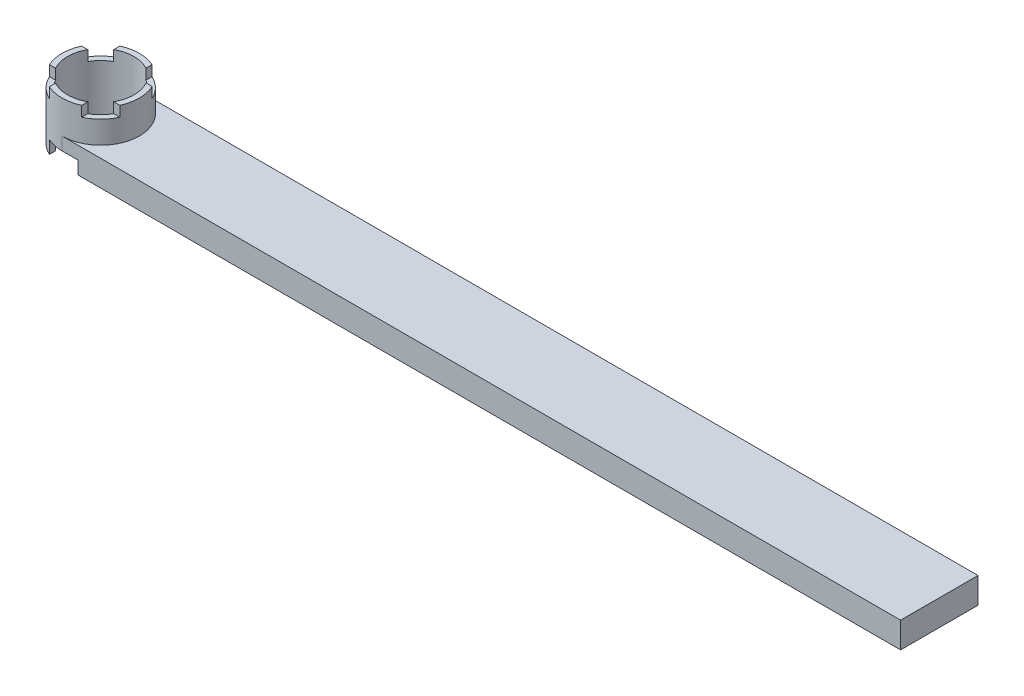
ISO-10303-21;
HEADER;
FILE_DESCRIPTION(('STEP AP214'),'2;1');
FILE_NAME('part.step','',(''),(''),'','','');
FILE_SCHEMA(('AUTOMOTIVE_DESIGN { 1 0 10303 214 1 1 1 1 }'));
ENDSEC;
DATA;
#1=APPLICATION_CONTEXT('core data for automotive mechanical design processes');
#2=APPLICATION_PROTOCOL_DEFINITION('international standard','automotive_design',2000,#1);
#3=PRODUCT_CONTEXT('',#1,'mechanical');
#4=PRODUCT('Part','Part','',(#3));
#5=PRODUCT_RELATED_PRODUCT_CATEGORY('part','',(#4));
#6=PRODUCT_DEFINITION_FORMATION('','',#4);
#7=PRODUCT_DEFINITION_CONTEXT('part definition',#1,'design');
#8=PRODUCT_DEFINITION('design','',#6,#7);
#9=PRODUCT_DEFINITION_SHAPE('','',#8);
#10=(LENGTH_UNIT() NAMED_UNIT(*) SI_UNIT(.MILLI.,.METRE.));
#11=(NAMED_UNIT(*) PLANE_ANGLE_UNIT() SI_UNIT($,.RADIAN.));
#12=(NAMED_UNIT(*) SI_UNIT($,.STERADIAN.) SOLID_ANGLE_UNIT());
#13=UNCERTAINTY_MEASURE_WITH_UNIT(LENGTH_MEASURE(1.E-05),#10,'distance_accuracy_value','');
#14=(GEOMETRIC_REPRESENTATION_CONTEXT(3) GLOBAL_UNCERTAINTY_ASSIGNED_CONTEXT((#13)) GLOBAL_UNIT_ASSIGNED_CONTEXT((#10,
#11,#12)) REPRESENTATION_CONTEXT('',''));
#15=CARTESIAN_POINT('',(0.,0.,0.));
#16=DIRECTION('',(0.,0.,1.));
#17=DIRECTION('',(1.,0.,0.));
#18=AXIS2_PLACEMENT_3D('',#15,#16,#17);
#19=CARTESIAN_POINT('',(0.,7.5,0.));
#20=DIRECTION('',(0.,1.,0.));
#21=DIRECTION('',(0.,0.,1.));
#22=AXIS2_PLACEMENT_3D('',#19,#20,#21);
#23=PLANE('',#22);
#24=CARTESIAN_POINT('',(0.,7.5,0.));
#25=DIRECTION('',(0.,1.,0.));
#26=DIRECTION('',(0.,0.,1.));
#27=AXIS2_PLACEMENT_3D('',#24,#25,#26);
#28=CIRCLE('',#27,6.);
#29=CARTESIAN_POINT('',(-2.5,7.5,-5.45435605731786));
#30=VERTEX_POINT('',#29);
#31=CARTESIAN_POINT('',(-5.45435605731786,7.5,-2.5));
#32=VERTEX_POINT('',#31);
#33=EDGE_CURVE('E719',#30,#32,#28,.T.);
#34=ORIENTED_EDGE('',*,*,#33,.T.);
#35=DIRECTION('',(1.,0.,0.));
#36=VECTOR('',#35,1.);
#37=CARTESIAN_POINT('',(0.,7.5,-2.5));
#38=LINE('',#37,#36);
#39=CARTESIAN_POINT('',(-4.50249930594109,7.5,-2.5));
#40=VERTEX_POINT('',#39);
#41=EDGE_CURVE('E298',#32,#40,#38,.T.);
#42=ORIENTED_EDGE('',*,*,#41,.T.);
#43=CARTESIAN_POINT('',(0.,7.5,0.));
#44=DIRECTION('',(0.,1.,0.));
#45=DIRECTION('',(0.,0.,1.));
#46=AXIS2_PLACEMENT_3D('',#43,#44,#45);
#47=CIRCLE('',#46,5.15);
#48=CARTESIAN_POINT('',(-2.5,7.5,-4.50249930594109));
#49=VERTEX_POINT('',#48);
#50=EDGE_CURVE('E692',#49,#40,#47,.T.);
#51=ORIENTED_EDGE('',*,*,#50,.F.);
#52=DIRECTION('',(0.,0.,-1.));
#53=VECTOR('',#52,1.);
#54=CARTESIAN_POINT('',(-2.5,7.5,0.));
#55=LINE('',#54,#53);
#56=EDGE_CURVE('E345',#49,#30,#55,.T.);
#57=ORIENTED_EDGE('',*,*,#56,.T.);
#58=EDGE_LOOP('',(#34,#42,#51,#57));
#59=FACE_BOUND('',#58,.T.);
#60=ADVANCED_FACE('F53',(#59),#23,.T.);
#61=CARTESIAN_POINT('',(-4.50249930594109,7.5,2.5));
#62=VERTEX_POINT('',#61);
#63=CARTESIAN_POINT('',(-2.5,7.5,4.50249930594109));
#64=VERTEX_POINT('',#63);
#65=EDGE_CURVE('E554',#62,#64,#47,.T.);
#66=ORIENTED_EDGE('',*,*,#65,.F.);
#67=DIRECTION('',(-1.,0.,0.));
#68=VECTOR('',#67,1.);
#69=CARTESIAN_POINT('',(0.,7.5,2.5));
#70=LINE('',#69,#68);
#71=CARTESIAN_POINT('',(-5.45435605731786,7.5,2.5));
#72=VERTEX_POINT('',#71);
#73=EDGE_CURVE('E320',#62,#72,#70,.T.);
#74=ORIENTED_EDGE('',*,*,#73,.T.);
#75=CARTESIAN_POINT('',(-2.5,7.5,5.45435605731786));
#76=VERTEX_POINT('',#75);
#77=EDGE_CURVE('E561',#72,#76,#28,.T.);
#78=ORIENTED_EDGE('',*,*,#77,.T.);
#79=DIRECTION('',(0.,0.,-1.));
#80=VECTOR('',#79,1.);
#81=CARTESIAN_POINT('',(-2.5,7.5,0.));
#82=LINE('',#81,#80);
#83=EDGE_CURVE('E421',#76,#64,#82,.T.);
#84=ORIENTED_EDGE('',*,*,#83,.T.);
#85=EDGE_LOOP('',(#66,#74,#78,#84));
#86=FACE_BOUND('',#85,.T.);
#87=ADVANCED_FACE('F725',(#86),#23,.T.);
#88=CARTESIAN_POINT('',(5.44050549122046,7.5,-2.53));
#89=VERTEX_POINT('',#88);
#90=CARTESIAN_POINT('',(2.5,7.5,-5.45435605731786));
#91=VERTEX_POINT('',#90);
#92=EDGE_CURVE('E560',#89,#91,#28,.T.);
#93=ORIENTED_EDGE('',*,*,#92,.T.);
#94=DIRECTION('',(0.,0.,1.));
#95=VECTOR('',#94,1.);
#96=CARTESIAN_POINT('',(2.5,7.5,0.));
#97=LINE('',#96,#95);
#98=CARTESIAN_POINT('',(2.5,7.5,-4.50249930594109));
#99=VERTEX_POINT('',#98);
#100=EDGE_CURVE('E355',#91,#99,#97,.T.);
#101=ORIENTED_EDGE('',*,*,#100,.T.);
#102=CARTESIAN_POINT('',(4.48571064604038,7.5,-2.53));
#103=VERTEX_POINT('',#102);
#104=EDGE_CURVE('E553',#103,#99,#47,.T.);
#105=ORIENTED_EDGE('',*,*,#104,.F.);
#106=DIRECTION('',(1.,0.,0.));
#107=VECTOR('',#106,1.);
#108=CARTESIAN_POINT('',(0.,7.5,-2.53));
#109=LINE('',#108,#107);
#110=EDGE_CURVE('E376',#103,#89,#109,.T.);
#111=ORIENTED_EDGE('',*,*,#110,.T.);
#112=EDGE_LOOP('',(#93,#101,#105,#111));
#113=FACE_BOUND('',#112,.T.);
#114=ADVANCED_FACE('F707',(#113),#23,.T.);
#115=CARTESIAN_POINT('',(2.5,7.5,5.45435605731786));
#116=VERTEX_POINT('',#115);
#117=CARTESIAN_POINT('',(5.45435605731786,7.5,2.5));
#118=VERTEX_POINT('',#117);
#119=EDGE_CURVE('E555',#116,#118,#28,.T.);
#120=ORIENTED_EDGE('',*,*,#119,.T.);
#121=DIRECTION('',(-1.,0.,0.));
#122=VECTOR('',#121,1.);
#123=CARTESIAN_POINT('',(0.,7.5,2.5));
#124=LINE('',#123,#122);
#125=CARTESIAN_POINT('',(4.50249930594109,7.5,2.5));
#126=VERTEX_POINT('',#125);
#127=EDGE_CURVE('E387',#118,#126,#124,.T.);
#128=ORIENTED_EDGE('',*,*,#127,.T.);
#129=CARTESIAN_POINT('',(2.5,7.5,4.50249930594109));
#130=VERTEX_POINT('',#129);
#131=EDGE_CURVE('E548',#130,#126,#47,.T.);
#132=ORIENTED_EDGE('',*,*,#131,.F.);
#133=DIRECTION('',(0.,0.,1.));
#134=VECTOR('',#133,1.);
#135=CARTESIAN_POINT('',(2.5,7.5,0.));
#136=LINE('',#135,#134);
#137=EDGE_CURVE('E410',#130,#116,#136,.T.);
#138=ORIENTED_EDGE('',*,*,#137,.T.);
#139=EDGE_LOOP('',(#120,#128,#132,#138));
#140=FACE_BOUND('',#139,.T.);
#141=ADVANCED_FACE('F741',(#140),#23,.T.);
#142=CARTESIAN_POINT('',(0.,4.,-6.));
#143=DIRECTION('',(0.,0.,-1.));
#144=DIRECTION('',(-1.,0.,0.));
#145=AXIS2_PLACEMENT_3D('',#142,#143,#144);
#146=PLANE('',#145);
#147=DIRECTION('',(1.,0.,0.));
#148=VECTOR('',#147,1.);
#149=CARTESIAN_POINT('',(0.,0.,-6.));
#150=LINE('',#149,#148);
#151=CARTESIAN_POINT('',(2.5,0.,-6.));
#152=VERTEX_POINT('',#151);
#153=CARTESIAN_POINT('',(130.,0.,-6.));
#154=VERTEX_POINT('',#153);
#155=EDGE_CURVE('E559',#152,#154,#150,.T.);
#156=ORIENTED_EDGE('',*,*,#155,.F.);
#157=DIRECTION('',(0.,1.,0.));
#158=VECTOR('',#157,1.);
#159=CARTESIAN_POINT('',(2.5,4.,-6.));
#160=LINE('',#159,#158);
#161=CARTESIAN_POINT('',(2.5,2.,-6.));
#162=VERTEX_POINT('',#161);
#163=EDGE_CURVE('E529',#152,#162,#160,.T.);
#164=ORIENTED_EDGE('',*,*,#163,.T.);
#165=DIRECTION('',(-1.,0.,0.));
#166=VECTOR('',#165,1.);
#167=CARTESIAN_POINT('',(0.,2.,-6.));
#168=LINE('',#167,#166);
#169=CARTESIAN_POINT('',(0.,2.,-6.));
#170=VERTEX_POINT('',#169);
#171=EDGE_CURVE('E544',#162,#170,#168,.T.);
#172=ORIENTED_EDGE('',*,*,#171,.T.);
#173=DIRECTION('',(0.,-1.,0.));
#174=VECTOR('',#173,1.);
#175=CARTESIAN_POINT('',(0.,4.,-6.));
#176=LINE('',#175,#174);
#177=CARTESIAN_POINT('',(0.,4.,-6.));
#178=VERTEX_POINT('',#177);
#179=EDGE_CURVE('E608',#178,#170,#176,.T.);
#180=ORIENTED_EDGE('',*,*,#179,.F.);
#181=DIRECTION('',(1.,0.,0.));
#182=VECTOR('',#181,1.);
#183=CARTESIAN_POINT('',(0.,4.,-6.));
#184=LINE('',#183,#182);
#185=CARTESIAN_POINT('',(130.,4.,-6.));
#186=VERTEX_POINT('',#185);
#187=EDGE_CURVE('E565',#178,#186,#184,.T.);
#188=ORIENTED_EDGE('',*,*,#187,.T.);
#189=DIRECTION('',(0.,-1.,0.));
#190=VECTOR('',#189,1.);
#191=CARTESIAN_POINT('',(130.,4.,-6.));
#192=LINE('',#191,#190);
#193=EDGE_CURVE('E577',#186,#154,#192,.T.);
#194=ORIENTED_EDGE('',*,*,#193,.T.);
#195=EDGE_LOOP('',(#156,#164,#172,#180,#188,#194));
#196=FACE_BOUND('',#195,.T.);
#197=ADVANCED_FACE('F55',(#196),#146,.T.);
#198=CARTESIAN_POINT('',(0.,4.,0.));
#199=DIRECTION('',(0.,-1.,0.));
#200=DIRECTION('',(0.,0.,-1.));
#201=AXIS2_PLACEMENT_3D('',#198,#199,#200);
#202=CYLINDRICAL_SURFACE('',#201,6.);
#203=ORIENTED_EDGE('',*,*,#119,.F.);
#204=DIRECTION('',(0.,-1.,0.));
#205=VECTOR('',#204,1.);
#206=CARTESIAN_POINT('',(2.5,9.1,5.45435605731786));
#207=LINE('',#206,#205);
#208=CARTESIAN_POINT('',(2.5,9.1,5.45435605731786));
#209=VERTEX_POINT('',#208);
#210=EDGE_CURVE('E433',#209,#116,#207,.T.);
#211=ORIENTED_EDGE('',*,*,#210,.F.);
#212=CARTESIAN_POINT('',(0.,9.1,0.));
#213=DIRECTION('',(0.,1.,0.));
#214=DIRECTION('',(0.,0.,1.));
#215=AXIS2_PLACEMENT_3D('',#212,#213,#214);
#216=CIRCLE('',#215,6.);
#217=CARTESIAN_POINT('',(-2.5,9.1,5.45435605731786));
#218=VERTEX_POINT('',#217);
#219=EDGE_CURVE('E409',#218,#209,#216,.T.);
#220=ORIENTED_EDGE('',*,*,#219,.F.);
#221=DIRECTION('',(0.,-1.,0.));
#222=VECTOR('',#221,1.);
#223=CARTESIAN_POINT('',(-2.5,9.1,5.45435605731786));
#224=LINE('',#223,#222);
#225=EDGE_CURVE('E391',#218,#76,#224,.T.);
#226=ORIENTED_EDGE('',*,*,#225,.T.);
#227=ORIENTED_EDGE('',*,*,#77,.F.);
#228=DIRECTION('',(0.,-1.,0.));
#229=VECTOR('',#228,1.);
#230=CARTESIAN_POINT('',(-5.45435605731786,9.1,2.5));
#231=LINE('',#230,#229);
#232=CARTESIAN_POINT('',(-5.45435605731786,9.1,2.5));
#233=VERTEX_POINT('',#232);
#234=EDGE_CURVE('E70',#233,#72,#231,.T.);
#235=ORIENTED_EDGE('',*,*,#234,.F.);
#236=CARTESIAN_POINT('',(0.,9.1,0.));
#237=DIRECTION('',(0.,1.,0.));
#238=DIRECTION('',(0.,0.,1.));
#239=AXIS2_PLACEMENT_3D('',#236,#237,#238);
#240=CIRCLE('',#239,6.);
#241=CARTESIAN_POINT('',(-5.45435605731786,9.1,-2.5));
#242=VERTEX_POINT('',#241);
#243=EDGE_CURVE('E305',#242,#233,#240,.T.);
#244=ORIENTED_EDGE('',*,*,#243,.F.);
#245=DIRECTION('',(0.,-1.,0.));
#246=VECTOR('',#245,1.);
#247=CARTESIAN_POINT('',(-5.45435605731786,9.1,-2.5));
#248=LINE('',#247,#246);
#249=EDGE_CURVE('E292',#242,#32,#248,.T.);
#250=ORIENTED_EDGE('',*,*,#249,.T.);
#251=ORIENTED_EDGE('',*,*,#33,.F.);
#252=DIRECTION('',(0.,-1.,0.));
#253=VECTOR('',#252,1.);
#254=CARTESIAN_POINT('',(-2.5,9.1,-5.45435605731786));
#255=LINE('',#254,#253);
#256=CARTESIAN_POINT('',(-2.5,9.1,-5.45435605731786));
#257=VERTEX_POINT('',#256);
#258=EDGE_CURVE('E78',#257,#30,#255,.T.);
#259=ORIENTED_EDGE('',*,*,#258,.F.);
#260=CARTESIAN_POINT('',(0.,9.1,0.));
#261=DIRECTION('',(0.,1.,0.));
#262=DIRECTION('',(0.,0.,1.));
#263=AXIS2_PLACEMENT_3D('',#260,#261,#262);
#264=CIRCLE('',#263,6.);
#265=CARTESIAN_POINT('',(2.5,9.1,-5.45435605731786));
#266=VERTEX_POINT('',#265);
#267=EDGE_CURVE('E344',#266,#257,#264,.T.);
#268=ORIENTED_EDGE('',*,*,#267,.F.);
#269=DIRECTION('',(0.,-1.,0.));
#270=VECTOR('',#269,1.);
#271=CARTESIAN_POINT('',(2.5,9.1,-5.45435605731786));
#272=LINE('',#271,#270);
#273=EDGE_CURVE('E331',#266,#91,#272,.T.);
#274=ORIENTED_EDGE('',*,*,#273,.T.);
#275=ORIENTED_EDGE('',*,*,#92,.F.);
#276=DIRECTION('',(0.,-1.,0.));
#277=VECTOR('',#276,1.);
#278=CARTESIAN_POINT('',(5.44050549122046,9.1,-2.53));
#279=LINE('',#278,#277);
#280=CARTESIAN_POINT('',(5.44050549122046,9.1,-2.53));
#281=VERTEX_POINT('',#280);
#282=EDGE_CURVE('E400',#281,#89,#279,.T.);
#283=ORIENTED_EDGE('',*,*,#282,.F.);
#284=CARTESIAN_POINT('',(0.,9.1,0.));
#285=DIRECTION('',(0.,1.,0.));
#286=DIRECTION('',(0.,0.,1.));
#287=AXIS2_PLACEMENT_3D('',#284,#285,#286);
#288=CIRCLE('',#287,6.);
#289=CARTESIAN_POINT('',(5.45435605731786,9.1,2.5));
#290=VERTEX_POINT('',#289);
#291=EDGE_CURVE('E375',#290,#281,#288,.T.);
#292=ORIENTED_EDGE('',*,*,#291,.F.);
#293=DIRECTION('',(0.,-1.,0.));
#294=VECTOR('',#293,1.);
#295=CARTESIAN_POINT('',(5.45435605731786,9.1,2.5));
#296=LINE('',#295,#294);
#297=EDGE_CURVE('E359',#290,#118,#296,.T.);
#298=ORIENTED_EDGE('',*,*,#297,.T.);
#299=EDGE_LOOP('',(#203,#211,#220,#226,#227,#235,#244,#250,#251,#259,#268,#274,#275,#283,#292,#298));
#300=FACE_BOUND('',#299,.T.);
#301=DIRECTION('',(0.,-1.,0.));
#302=VECTOR('',#301,1.);
#303=CARTESIAN_POINT('',(-2.5,4.,5.45435605731786));
#304=LINE('',#303,#302);
#305=CARTESIAN_POINT('',(-2.5,2.,5.45435605731786));
#306=VERTEX_POINT('',#305);
#307=CARTESIAN_POINT('',(-2.5,0.,5.45435605731786));
#308=VERTEX_POINT('',#307);
#309=EDGE_CURVE('E501',#306,#308,#304,.T.);
#310=ORIENTED_EDGE('',*,*,#309,.F.);
#311=CARTESIAN_POINT('',(0.,2.,0.));
#312=DIRECTION('',(0.,-1.,0.));
#313=DIRECTION('',(0.,0.,-1.));
#314=AXIS2_PLACEMENT_3D('',#311,#312,#313);
#315=CIRCLE('',#314,6.);
#316=CARTESIAN_POINT('',(0.,2.,6.));
#317=VERTEX_POINT('',#316);
#318=EDGE_CURVE('E539',#317,#306,#315,.T.);
#319=ORIENTED_EDGE('',*,*,#318,.F.);
#320=DIRECTION('',(0.,-1.,0.));
#321=VECTOR('',#320,1.);
#322=CARTESIAN_POINT('',(0.,4.,6.));
#323=LINE('',#322,#321);
#324=CARTESIAN_POINT('',(0.,4.,6.));
#325=VERTEX_POINT('',#324);
#326=EDGE_CURVE('E604',#325,#317,#323,.T.);
#327=ORIENTED_EDGE('',*,*,#326,.F.);
#328=CARTESIAN_POINT('',(0.,4.,0.));
#329=DIRECTION('',(0.,1.,0.));
#330=DIRECTION('',(0.,0.,1.));
#331=AXIS2_PLACEMENT_3D('',#328,#329,#330);
#332=CIRCLE('',#331,6.);
#333=EDGE_CURVE('E552',#325,#178,#332,.T.);
#334=ORIENTED_EDGE('',*,*,#333,.T.);
#335=ORIENTED_EDGE('',*,*,#179,.T.);
#336=CARTESIAN_POINT('',(-2.5,2.,-5.45435605731786));
#337=VERTEX_POINT('',#336);
#338=EDGE_CURVE('E542',#337,#170,#315,.T.);
#339=ORIENTED_EDGE('',*,*,#338,.F.);
#340=DIRECTION('',(0.,-1.,0.));
#341=VECTOR('',#340,1.);
#342=CARTESIAN_POINT('',(-2.5,4.,-5.45435605731786));
#343=LINE('',#342,#341);
#344=CARTESIAN_POINT('',(-2.5,0.,-5.45435605731786));
#345=VERTEX_POINT('',#344);
#346=EDGE_CURVE('E521',#337,#345,#343,.T.);
#347=ORIENTED_EDGE('',*,*,#346,.T.);
#348=CARTESIAN_POINT('',(0.,0.,0.));
#349=DIRECTION('',(0.,1.,0.));
#350=DIRECTION('',(0.,0.,1.));
#351=AXIS2_PLACEMENT_3D('',#348,#349,#350);
#352=CIRCLE('',#351,6.);
#353=CARTESIAN_POINT('',(-5.45435605731786,0.,-2.5));
#354=VERTEX_POINT('',#353);
#355=EDGE_CURVE('E584',#345,#354,#352,.T.);
#356=ORIENTED_EDGE('',*,*,#355,.T.);
#357=DIRECTION('',(0.,-1.,0.));
#358=VECTOR('',#357,1.);
#359=CARTESIAN_POINT('',(-5.45435605731786,4.,-2.5));
#360=LINE('',#359,#358);
#361=CARTESIAN_POINT('',(-5.45435605731786,2.,-2.5));
#362=VERTEX_POINT('',#361);
#363=EDGE_CURVE('E514',#354,#362,#360,.F.);
#364=ORIENTED_EDGE('',*,*,#363,.T.);
#365=CARTESIAN_POINT('',(-5.45435605731786,2.,2.5));
#366=VERTEX_POINT('',#365);
#367=EDGE_CURVE('E543',#366,#362,#315,.T.);
#368=ORIENTED_EDGE('',*,*,#367,.F.);
#369=DIRECTION('',(0.,-1.,0.));
#370=VECTOR('',#369,1.);
#371=CARTESIAN_POINT('',(-5.45435605731786,4.,2.5));
#372=LINE('',#371,#370);
#373=CARTESIAN_POINT('',(-5.45435605731786,0.,2.5));
#374=VERTEX_POINT('',#373);
#375=EDGE_CURVE('E508',#374,#366,#372,.F.);
#376=ORIENTED_EDGE('',*,*,#375,.F.);
#377=EDGE_CURVE('E580',#374,#308,#352,.T.);
#378=ORIENTED_EDGE('',*,*,#377,.T.);
#379=EDGE_LOOP('',(#310,#319,#327,#334,#335,#339,#347,#356,#364,#368,#376,#378));
#380=FACE_BOUND('',#379,.T.);
#381=ADVANCED_FACE('F307',(#300,#380),#202,.T.);
#382=CARTESIAN_POINT('',(0.,4.,0.));
#383=DIRECTION('',(0.,-1.,0.));
#384=DIRECTION('',(0.,0.,-1.));
#385=AXIS2_PLACEMENT_3D('',#382,#383,#384);
#386=CYLINDRICAL_SURFACE('',#385,5.15);
#387=DIRECTION('',(0.,-1.,0.));
#388=VECTOR('',#387,1.);
#389=CARTESIAN_POINT('',(4.50249930594109,4.,-2.5));
#390=LINE('',#389,#388);
#391=CARTESIAN_POINT('',(4.50249930594109,2.,-2.5));
#392=VERTEX_POINT('',#391);
#393=CARTESIAN_POINT('',(4.50249930594109,0.,-2.5));
#394=VERTEX_POINT('',#393);
#395=EDGE_CURVE('E533',#392,#394,#390,.T.);
#396=ORIENTED_EDGE('',*,*,#395,.F.);
#397=CARTESIAN_POINT('',(0.,2.,0.));
#398=DIRECTION('',(0.,-1.,0.));
#399=DIRECTION('',(0.,0.,-1.));
#400=AXIS2_PLACEMENT_3D('',#397,#398,#399);
#401=CIRCLE('',#400,5.15);
#402=CARTESIAN_POINT('',(4.50249930594109,2.,2.5));
#403=VERTEX_POINT('',#402);
#404=EDGE_CURVE('E12',#392,#403,#401,.T.);
#405=ORIENTED_EDGE('',*,*,#404,.T.);
#406=DIRECTION('',(0.,-1.,0.));
#407=VECTOR('',#406,1.);
#408=CARTESIAN_POINT('',(4.50249930594109,4.,2.5));
#409=LINE('',#408,#407);
#410=CARTESIAN_POINT('',(4.50249930594109,0.,2.5));
#411=VERTEX_POINT('',#410);
#412=EDGE_CURVE('E487',#411,#403,#409,.F.);
#413=ORIENTED_EDGE('',*,*,#412,.F.);
#414=CARTESIAN_POINT('',(0.,0.,0.));
#415=DIRECTION('',(0.,1.,0.));
#416=DIRECTION('',(0.,0.,1.));
#417=AXIS2_PLACEMENT_3D('',#414,#415,#416);
#418=CIRCLE('',#417,5.15);
#419=CARTESIAN_POINT('',(2.5,0.,4.50249930594109));
#420=VERTEX_POINT('',#419);
#421=EDGE_CURVE('E570',#420,#411,#418,.T.);
#422=ORIENTED_EDGE('',*,*,#421,.F.);
#423=DIRECTION('',(0.,-1.,0.));
#424=VECTOR('',#423,1.);
#425=CARTESIAN_POINT('',(2.5,4.,4.50249930594109));
#426=LINE('',#425,#424);
#427=CARTESIAN_POINT('',(2.5,2.,4.50249930594109));
#428=VERTEX_POINT('',#427);
#429=EDGE_CURVE('E490',#428,#420,#426,.T.);
#430=ORIENTED_EDGE('',*,*,#429,.F.);
#431=CARTESIAN_POINT('',(-2.5,2.,4.50249930594109));
#432=VERTEX_POINT('',#431);
#433=EDGE_CURVE('E63',#428,#432,#401,.T.);
#434=ORIENTED_EDGE('',*,*,#433,.T.);
#435=DIRECTION('',(0.,-1.,0.));
#436=VECTOR('',#435,1.);
#437=CARTESIAN_POINT('',(-2.5,4.,4.50249930594109));
#438=LINE('',#437,#436);
#439=CARTESIAN_POINT('',(-2.5,0.,4.50249930594109));
#440=VERTEX_POINT('',#439);
#441=EDGE_CURVE('E497',#432,#440,#438,.T.);
#442=ORIENTED_EDGE('',*,*,#441,.T.);
#443=CARTESIAN_POINT('',(-4.50249930594109,0.,2.5));
#444=VERTEX_POINT('',#443);
#445=EDGE_CURVE('E592',#444,#440,#418,.T.);
#446=ORIENTED_EDGE('',*,*,#445,.F.);
#447=DIRECTION('',(0.,-1.,0.));
#448=VECTOR('',#447,1.);
#449=CARTESIAN_POINT('',(-4.50249930594109,4.,2.5));
#450=LINE('',#449,#448);
#451=CARTESIAN_POINT('',(-4.50249930594109,2.,2.5));
#452=VERTEX_POINT('',#451);
#453=EDGE_CURVE('E504',#444,#452,#450,.F.);
#454=ORIENTED_EDGE('',*,*,#453,.T.);
#455=CARTESIAN_POINT('',(-4.50249930594109,2.,-2.5));
#456=VERTEX_POINT('',#455);
#457=EDGE_CURVE('E639',#452,#456,#401,.T.);
#458=ORIENTED_EDGE('',*,*,#457,.T.);
#459=DIRECTION('',(0.,-1.,0.));
#460=VECTOR('',#459,1.);
#461=CARTESIAN_POINT('',(-4.50249930594109,4.,-2.5));
#462=LINE('',#461,#460);
#463=CARTESIAN_POINT('',(-4.50249930594109,0.,-2.5));
#464=VERTEX_POINT('',#463);
#465=EDGE_CURVE('E511',#464,#456,#462,.F.);
#466=ORIENTED_EDGE('',*,*,#465,.F.);
#467=CARTESIAN_POINT('',(-2.5,0.,-4.50249930594109));
#468=VERTEX_POINT('',#467);
#469=EDGE_CURVE('E969',#468,#464,#418,.T.);
#470=ORIENTED_EDGE('',*,*,#469,.F.);
#471=DIRECTION('',(0.,-1.,0.));
#472=VECTOR('',#471,1.);
#473=CARTESIAN_POINT('',(-2.5,4.,-4.50249930594109));
#474=LINE('',#473,#472);
#475=CARTESIAN_POINT('',(-2.5,2.,-4.50249930594109));
#476=VERTEX_POINT('',#475);
#477=EDGE_CURVE('E518',#476,#468,#474,.T.);
#478=ORIENTED_EDGE('',*,*,#477,.F.);
#479=CARTESIAN_POINT('',(2.5,2.,-4.50249930594109));
#480=VERTEX_POINT('',#479);
#481=EDGE_CURVE('E57',#476,#480,#401,.T.);
#482=ORIENTED_EDGE('',*,*,#481,.T.);
#483=DIRECTION('',(0.,-1.,0.));
#484=VECTOR('',#483,1.);
#485=CARTESIAN_POINT('',(2.5,4.,-4.50249930594109));
#486=LINE('',#485,#484);
#487=CARTESIAN_POINT('',(2.5,0.,-4.50249930594109));
#488=VERTEX_POINT('',#487);
#489=EDGE_CURVE('E525',#480,#488,#486,.T.);
#490=ORIENTED_EDGE('',*,*,#489,.T.);
#491=EDGE_CURVE('E596',#394,#488,#418,.T.);
#492=ORIENTED_EDGE('',*,*,#491,.F.);
#493=EDGE_LOOP('',(#396,#405,#413,#422,#430,#434,#442,#446,#454,#458,#466,#470,#478,#482,#490,#492));
#494=FACE_BOUND('',#493,.T.);
#495=ORIENTED_EDGE('',*,*,#131,.T.);
#496=DIRECTION('',(0.,-1.,0.));
#497=VECTOR('',#496,1.);
#498=CARTESIAN_POINT('',(4.50249930594109,9.1,2.5));
#499=LINE('',#498,#497);
#500=CARTESIAN_POINT('',(4.50249930594109,9.1,2.5));
#501=VERTEX_POINT('',#500);
#502=EDGE_CURVE('E386',#501,#126,#499,.T.);
#503=ORIENTED_EDGE('',*,*,#502,.F.);
#504=CARTESIAN_POINT('',(0.,9.1,0.));
#505=DIRECTION('',(0.,1.,0.));
#506=DIRECTION('',(0.,0.,1.));
#507=AXIS2_PLACEMENT_3D('',#504,#505,#506);
#508=CIRCLE('',#507,5.15);
#509=CARTESIAN_POINT('',(4.48571064604038,9.1,-2.53));
#510=VERTEX_POINT('',#509);
#511=EDGE_CURVE('E383',#510,#501,#508,.F.);
#512=ORIENTED_EDGE('',*,*,#511,.F.);
#513=DIRECTION('',(0.,-1.,0.));
#514=VECTOR('',#513,1.);
#515=CARTESIAN_POINT('',(4.48571064604038,9.1,-2.53));
#516=LINE('',#515,#514);
#517=EDGE_CURVE('E397',#510,#103,#516,.T.);
#518=ORIENTED_EDGE('',*,*,#517,.T.);
#519=ORIENTED_EDGE('',*,*,#104,.T.);
#520=DIRECTION('',(0.,-1.,0.));
#521=VECTOR('',#520,1.);
#522=CARTESIAN_POINT('',(2.5,9.1,-4.50249930594109));
#523=LINE('',#522,#521);
#524=CARTESIAN_POINT('',(2.5,9.1,-4.50249930594109));
#525=VERTEX_POINT('',#524);
#526=EDGE_CURVE('E354',#525,#99,#523,.T.);
#527=ORIENTED_EDGE('',*,*,#526,.F.);
#528=CARTESIAN_POINT('',(0.,9.1,0.));
#529=DIRECTION('',(0.,1.,0.));
#530=DIRECTION('',(0.,0.,1.));
#531=AXIS2_PLACEMENT_3D('',#528,#529,#530);
#532=CIRCLE('',#531,5.15);
#533=CARTESIAN_POINT('',(-2.5,9.1,-4.50249930594109));
#534=VERTEX_POINT('',#533);
#535=EDGE_CURVE('E351',#534,#525,#532,.F.);
#536=ORIENTED_EDGE('',*,*,#535,.F.);
#537=DIRECTION('',(0.,-1.,0.));
#538=VECTOR('',#537,1.);
#539=CARTESIAN_POINT('',(-2.5,9.1,-4.50249930594109));
#540=LINE('',#539,#538);
#541=EDGE_CURVE('E364',#534,#49,#540,.T.);
#542=ORIENTED_EDGE('',*,*,#541,.T.);
#543=ORIENTED_EDGE('',*,*,#50,.T.);
#544=DIRECTION('',(0.,-1.,0.));
#545=VECTOR('',#544,1.);
#546=CARTESIAN_POINT('',(-4.50249930594109,9.1,-2.5));
#547=LINE('',#546,#545);
#548=CARTESIAN_POINT('',(-4.50249930594109,9.1,-2.5));
#549=VERTEX_POINT('',#548);
#550=EDGE_CURVE('E329',#549,#40,#547,.T.);
#551=ORIENTED_EDGE('',*,*,#550,.F.);
#552=CARTESIAN_POINT('',(0.,9.1,0.));
#553=DIRECTION('',(0.,1.,0.));
#554=DIRECTION('',(0.,0.,1.));
#555=AXIS2_PLACEMENT_3D('',#552,#553,#554);
#556=CIRCLE('',#555,5.15);
#557=CARTESIAN_POINT('',(-4.50249930594109,9.1,2.5));
#558=VERTEX_POINT('',#557);
#559=EDGE_CURVE('E317',#558,#549,#556,.F.);
#560=ORIENTED_EDGE('',*,*,#559,.F.);
#561=DIRECTION('',(0.,-1.,0.));
#562=VECTOR('',#561,1.);
#563=CARTESIAN_POINT('',(-4.50249930594109,9.1,2.5));
#564=LINE('',#563,#562);
#565=EDGE_CURVE('E335',#558,#62,#564,.T.);
#566=ORIENTED_EDGE('',*,*,#565,.T.);
#567=ORIENTED_EDGE('',*,*,#65,.T.);
#568=DIRECTION('',(0.,-1.,0.));
#569=VECTOR('',#568,1.);
#570=CARTESIAN_POINT('',(-2.5,9.1,4.50249930594109));
#571=LINE('',#570,#569);
#572=CARTESIAN_POINT('',(-2.5,9.1,4.50249930594109));
#573=VERTEX_POINT('',#572);
#574=EDGE_CURVE('E420',#573,#64,#571,.T.);
#575=ORIENTED_EDGE('',*,*,#574,.F.);
#576=CARTESIAN_POINT('',(0.,9.1,0.));
#577=DIRECTION('',(0.,1.,0.));
#578=DIRECTION('',(0.,0.,1.));
#579=AXIS2_PLACEMENT_3D('',#576,#577,#578);
#580=CIRCLE('',#579,5.15);
#581=CARTESIAN_POINT('',(2.5,9.1,4.50249930594109));
#582=VERTEX_POINT('',#581);
#583=EDGE_CURVE('E417',#582,#573,#580,.F.);
#584=ORIENTED_EDGE('',*,*,#583,.F.);
#585=DIRECTION('',(0.,-1.,0.));
#586=VECTOR('',#585,1.);
#587=CARTESIAN_POINT('',(2.5,9.1,4.50249930594109));
#588=LINE('',#587,#586);
#589=EDGE_CURVE('E430',#582,#130,#588,.T.);
#590=ORIENTED_EDGE('',*,*,#589,.T.);
#591=EDGE_LOOP('',(#495,#503,#512,#518,#519,#527,#536,#542,#543,#551,#560,#566,#567,#575,#584,#590));
#592=FACE_BOUND('',#591,.T.);
#593=ADVANCED_FACE('F649',(#494,#592),#386,.F.);
#594=CARTESIAN_POINT('',(0.,0.,0.));
#595=DIRECTION('',(0.,1.,0.));
#596=DIRECTION('',(0.,0.,1.));
#597=AXIS2_PLACEMENT_3D('',#594,#595,#596);
#598=PLANE('',#597);
#599=DIRECTION('',(0.,0.,1.));
#600=VECTOR('',#599,1.);
#601=CARTESIAN_POINT('',(2.5,0.,0.));
#602=LINE('',#601,#600);
#603=EDGE_CURVE('E633',#152,#488,#602,.T.);
#604=ORIENTED_EDGE('',*,*,#603,.F.);
#605=ORIENTED_EDGE('',*,*,#155,.T.);
#606=DIRECTION('',(0.,0.,1.));
#607=VECTOR('',#606,1.);
#608=CARTESIAN_POINT('',(130.,0.,0.));
#609=LINE('',#608,#607);
#610=CARTESIAN_POINT('',(130.,0.,6.));
#611=VERTEX_POINT('',#610);
#612=EDGE_CURVE('E588',#154,#611,#609,.T.);
#613=ORIENTED_EDGE('',*,*,#612,.T.);
#614=DIRECTION('',(1.,0.,0.));
#615=VECTOR('',#614,1.);
#616=CARTESIAN_POINT('',(0.,0.,6.));
#617=LINE('',#616,#615);
#618=CARTESIAN_POINT('',(2.5,0.,6.));
#619=VERTEX_POINT('',#618);
#620=EDGE_CURVE('E585',#619,#611,#617,.T.);
#621=ORIENTED_EDGE('',*,*,#620,.F.);
#622=DIRECTION('',(0.,0.,-1.));
#623=VECTOR('',#622,1.);
#624=CARTESIAN_POINT('',(2.5,0.,0.));
#625=LINE('',#624,#623);
#626=EDGE_CURVE('E616',#619,#420,#625,.T.);
#627=ORIENTED_EDGE('',*,*,#626,.T.);
#628=ORIENTED_EDGE('',*,*,#421,.T.);
#629=DIRECTION('',(-1.,0.,0.));
#630=VECTOR('',#629,1.);
#631=CARTESIAN_POINT('',(6.,0.,2.5));
#632=LINE('',#631,#630);
#633=CARTESIAN_POINT('',(6.,0.,2.5));
#634=VERTEX_POINT('',#633);
#635=EDGE_CURVE('E443',#634,#411,#632,.T.);
#636=ORIENTED_EDGE('',*,*,#635,.F.);
#637=DIRECTION('',(0.,0.,-1.));
#638=VECTOR('',#637,1.);
#639=CARTESIAN_POINT('',(6.,0.,2.5));
#640=LINE('',#639,#638);
#641=CARTESIAN_POINT('',(6.,0.,-2.5));
#642=VERTEX_POINT('',#641);
#643=EDGE_CURVE('E303',#634,#642,#640,.T.);
#644=ORIENTED_EDGE('',*,*,#643,.T.);
#645=DIRECTION('',(-1.,0.,0.));
#646=VECTOR('',#645,1.);
#647=CARTESIAN_POINT('',(0.,0.,-2.5));
#648=LINE('',#647,#646);
#649=EDGE_CURVE('E612',#642,#394,#648,.T.);
#650=ORIENTED_EDGE('',*,*,#649,.T.);
#651=ORIENTED_EDGE('',*,*,#491,.T.);
#652=EDGE_LOOP('',(#604,#605,#613,#621,#627,#628,#636,#644,#650,#651));
#653=FACE_BOUND('',#652,.T.);
#654=ADVANCED_FACE('F666',(#653),#598,.F.);
#655=DIRECTION('',(-1.,0.,0.));
#656=VECTOR('',#655,1.);
#657=CARTESIAN_POINT('',(0.,0.,2.5));
#658=LINE('',#657,#656);
#659=EDGE_CURVE('E623',#444,#374,#658,.T.);
#660=ORIENTED_EDGE('',*,*,#659,.F.);
#661=ORIENTED_EDGE('',*,*,#445,.T.);
#662=DIRECTION('',(0.,0.,-1.));
#663=VECTOR('',#662,1.);
#664=CARTESIAN_POINT('',(-2.5,0.,0.));
#665=LINE('',#664,#663);
#666=EDGE_CURVE('E620',#308,#440,#665,.T.);
#667=ORIENTED_EDGE('',*,*,#666,.F.);
#668=ORIENTED_EDGE('',*,*,#377,.F.);
#669=EDGE_LOOP('',(#660,#661,#667,#668));
#670=FACE_BOUND('',#669,.T.);
#671=ADVANCED_FACE('F978',(#670),#598,.F.);
#672=ORIENTED_EDGE('',*,*,#355,.F.);
#673=DIRECTION('',(0.,0.,1.));
#674=VECTOR('',#673,1.);
#675=CARTESIAN_POINT('',(-2.5,0.,0.));
#676=LINE('',#675,#674);
#677=EDGE_CURVE('E630',#345,#468,#676,.T.);
#678=ORIENTED_EDGE('',*,*,#677,.T.);
#679=ORIENTED_EDGE('',*,*,#469,.T.);
#680=DIRECTION('',(-1.,0.,0.));
#681=VECTOR('',#680,1.);
#682=CARTESIAN_POINT('',(0.,0.,-2.5));
#683=LINE('',#682,#681);
#684=EDGE_CURVE('E626',#464,#354,#683,.T.);
#685=ORIENTED_EDGE('',*,*,#684,.T.);
#686=EDGE_LOOP('',(#672,#678,#679,#685));
#687=FACE_BOUND('',#686,.T.);
#688=ADVANCED_FACE('F981',(#687),#598,.F.);
#689=CARTESIAN_POINT('',(0.,4.,6.));
#690=DIRECTION('',(0.,0.,-1.));
#691=DIRECTION('',(-1.,0.,0.));
#692=AXIS2_PLACEMENT_3D('',#689,#690,#691);
#693=PLANE('',#692);
#694=DIRECTION('',(-1.,0.,0.));
#695=VECTOR('',#694,1.);
#696=CARTESIAN_POINT('',(0.,2.,6.));
#697=LINE('',#696,#695);
#698=CARTESIAN_POINT('',(2.5,2.,6.));
#699=VERTEX_POINT('',#698);
#700=EDGE_CURVE('E536',#699,#317,#697,.T.);
#701=ORIENTED_EDGE('',*,*,#700,.F.);
#702=DIRECTION('',(0.,-1.,0.));
#703=VECTOR('',#702,1.);
#704=CARTESIAN_POINT('',(2.5,4.,6.));
#705=LINE('',#704,#703);
#706=EDGE_CURVE('E493',#699,#619,#705,.T.);
#707=ORIENTED_EDGE('',*,*,#706,.T.);
#708=ORIENTED_EDGE('',*,*,#620,.T.);
#709=DIRECTION('',(0.,-1.,0.));
#710=VECTOR('',#709,1.);
#711=CARTESIAN_POINT('',(130.,4.,6.));
#712=LINE('',#711,#710);
#713=CARTESIAN_POINT('',(130.,4.,6.));
#714=VERTEX_POINT('',#713);
#715=EDGE_CURVE('E600',#714,#611,#712,.T.);
#716=ORIENTED_EDGE('',*,*,#715,.F.);
#717=DIRECTION('',(1.,0.,0.));
#718=VECTOR('',#717,1.);
#719=CARTESIAN_POINT('',(0.,4.,6.));
#720=LINE('',#719,#718);
#721=EDGE_CURVE('E569',#325,#714,#720,.T.);
#722=ORIENTED_EDGE('',*,*,#721,.F.);
#723=ORIENTED_EDGE('',*,*,#326,.T.);
#724=EDGE_LOOP('',(#701,#707,#708,#716,#722,#723));
#725=FACE_BOUND('',#724,.T.);
#726=ADVANCED_FACE('F663',(#725),#693,.F.);
#727=CARTESIAN_POINT('',(130.,4.,0.));
#728=DIRECTION('',(1.,0.,0.));
#729=DIRECTION('',(0.,0.,-1.));
#730=AXIS2_PLACEMENT_3D('',#727,#728,#729);
#731=PLANE('',#730);
#732=ORIENTED_EDGE('',*,*,#612,.F.);
#733=ORIENTED_EDGE('',*,*,#193,.F.);
#734=DIRECTION('',(0.,0.,1.));
#735=VECTOR('',#734,1.);
#736=CARTESIAN_POINT('',(130.,4.,0.));
#737=LINE('',#736,#735);
#738=EDGE_CURVE('E573',#186,#714,#737,.T.);
#739=ORIENTED_EDGE('',*,*,#738,.T.);
#740=ORIENTED_EDGE('',*,*,#715,.T.);
#741=EDGE_LOOP('',(#732,#733,#739,#740));
#742=FACE_BOUND('',#741,.T.);
#743=ADVANCED_FACE('F670',(#742),#731,.T.);
#744=CARTESIAN_POINT('',(0.,4.,0.));
#745=DIRECTION('',(0.,1.,0.));
#746=DIRECTION('',(0.,0.,1.));
#747=AXIS2_PLACEMENT_3D('',#744,#745,#746);
#748=PLANE('',#747);
#749=ORIENTED_EDGE('',*,*,#333,.F.);
#750=ORIENTED_EDGE('',*,*,#721,.T.);
#751=ORIENTED_EDGE('',*,*,#738,.F.);
#752=ORIENTED_EDGE('',*,*,#187,.F.);
#753=EDGE_LOOP('',(#749,#750,#751,#752));
#754=FACE_BOUND('',#753,.T.);
#755=ADVANCED_FACE('F678',(#754),#748,.T.);
#756=CARTESIAN_POINT('',(6.,2.,2.5));
#757=DIRECTION('',(0.,0.,1.));
#758=DIRECTION('',(1.,0.,0.));
#759=AXIS2_PLACEMENT_3D('',#756,#757,#758);
#760=PLANE('',#759);
#761=ORIENTED_EDGE('',*,*,#412,.T.);
#762=DIRECTION('',(-1.,0.,0.));
#763=VECTOR('',#762,1.);
#764=CARTESIAN_POINT('',(6.,2.,2.5));
#765=LINE('',#764,#763);
#766=CARTESIAN_POINT('',(6.,2.,2.5));
#767=VERTEX_POINT('',#766);
#768=EDGE_CURVE('E470',#767,#403,#765,.T.);
#769=ORIENTED_EDGE('',*,*,#768,.F.);
#770=DIRECTION('',(0.,-1.,0.));
#771=VECTOR('',#770,1.);
#772=CARTESIAN_POINT('',(6.,2.,2.5));
#773=LINE('',#772,#771);
#774=EDGE_CURVE('E474',#767,#634,#773,.T.);
#775=ORIENTED_EDGE('',*,*,#774,.T.);
#776=ORIENTED_EDGE('',*,*,#635,.T.);
#777=EDGE_LOOP('',(#761,#769,#775,#776));
#778=FACE_BOUND('',#777,.T.);
#779=ADVANCED_FACE('F926',(#778),#760,.F.);
#780=CARTESIAN_POINT('',(2.5,2.,-2.5));
#781=DIRECTION('',(0.,0.,-1.));
#782=DIRECTION('',(-1.,0.,0.));
#783=AXIS2_PLACEMENT_3D('',#780,#781,#782);
#784=PLANE('',#783);
#785=ORIENTED_EDGE('',*,*,#395,.T.);
#786=ORIENTED_EDGE('',*,*,#649,.F.);
#787=DIRECTION('',(0.,-1.,0.));
#788=VECTOR('',#787,1.);
#789=CARTESIAN_POINT('',(6.,2.,-2.5));
#790=LINE('',#789,#788);
#791=CARTESIAN_POINT('',(6.,2.,-2.5));
#792=VERTEX_POINT('',#791);
#793=EDGE_CURVE('E483',#792,#642,#790,.T.);
#794=ORIENTED_EDGE('',*,*,#793,.F.);
#795=DIRECTION('',(1.,0.,0.));
#796=VECTOR('',#795,1.);
#797=CARTESIAN_POINT('',(2.5,2.,-2.5));
#798=LINE('',#797,#796);
#799=EDGE_CURVE('E442',#392,#792,#798,.T.);
#800=ORIENTED_EDGE('',*,*,#799,.F.);
#801=EDGE_LOOP('',(#785,#786,#794,#800));
#802=FACE_BOUND('',#801,.T.);
#803=ADVANCED_FACE('F929',(#802),#784,.F.);
#804=CARTESIAN_POINT('',(6.,2.,2.5));
#805=DIRECTION('',(-1.,0.,0.));
#806=DIRECTION('',(0.,0.,1.));
#807=AXIS2_PLACEMENT_3D('',#804,#805,#806);
#808=PLANE('',#807);
#809=ORIENTED_EDGE('',*,*,#643,.F.);
#810=ORIENTED_EDGE('',*,*,#774,.F.);
#811=DIRECTION('',(0.,0.,-1.));
#812=VECTOR('',#811,1.);
#813=CARTESIAN_POINT('',(6.,2.,2.5));
#814=LINE('',#813,#812);
#815=EDGE_CURVE('E438',#767,#792,#814,.T.);
#816=ORIENTED_EDGE('',*,*,#815,.T.);
#817=ORIENTED_EDGE('',*,*,#793,.T.);
#818=EDGE_LOOP('',(#809,#810,#816,#817));
#819=FACE_BOUND('',#818,.T.);
#820=ADVANCED_FACE('F952',(#819),#808,.T.);
#821=CARTESIAN_POINT('',(0.,2.,0.));
#822=DIRECTION('',(0.,-1.,0.));
#823=DIRECTION('',(0.,0.,-1.));
#824=AXIS2_PLACEMENT_3D('',#821,#822,#823);
#825=PLANE('',#824);
#826=ORIENTED_EDGE('',*,*,#799,.T.);
#827=ORIENTED_EDGE('',*,*,#815,.F.);
#828=ORIENTED_EDGE('',*,*,#768,.T.);
#829=ORIENTED_EDGE('',*,*,#404,.F.);
#830=EDGE_LOOP('',(#826,#827,#828,#829));
#831=FACE_BOUND('',#830,.T.);
#832=ADVANCED_FACE('F925',(#831),#825,.T.);
#833=CARTESIAN_POINT('',(-2.5,2.,2.5));
#834=DIRECTION('',(1.,0.,0.));
#835=DIRECTION('',(0.,0.,-1.));
#836=AXIS2_PLACEMENT_3D('',#833,#834,#835);
#837=PLANE('',#836);
#838=ORIENTED_EDGE('',*,*,#309,.T.);
#839=ORIENTED_EDGE('',*,*,#666,.T.);
#840=ORIENTED_EDGE('',*,*,#441,.F.);
#841=DIRECTION('',(0.,0.,1.));
#842=VECTOR('',#841,1.);
#843=CARTESIAN_POINT('',(-2.5,2.,2.5));
#844=LINE('',#843,#842);
#845=EDGE_CURVE('E462',#432,#306,#844,.T.);
#846=ORIENTED_EDGE('',*,*,#845,.T.);
#847=EDGE_LOOP('',(#838,#839,#840,#846));
#848=FACE_BOUND('',#847,.T.);
#849=ADVANCED_FACE('F933',(#848),#837,.T.);
#850=CARTESIAN_POINT('',(2.5,2.,2.5));
#851=DIRECTION('',(1.,0.,0.));
#852=DIRECTION('',(0.,0.,-1.));
#853=AXIS2_PLACEMENT_3D('',#850,#851,#852);
#854=PLANE('',#853);
#855=DIRECTION('',(0.,0.,1.));
#856=VECTOR('',#855,1.);
#857=CARTESIAN_POINT('',(2.5,2.,2.5));
#858=LINE('',#857,#856);
#859=EDGE_CURVE('E466',#428,#699,#858,.T.);
#860=ORIENTED_EDGE('',*,*,#859,.F.);
#861=ORIENTED_EDGE('',*,*,#429,.T.);
#862=ORIENTED_EDGE('',*,*,#626,.F.);
#863=ORIENTED_EDGE('',*,*,#706,.F.);
#864=EDGE_LOOP('',(#860,#861,#862,#863));
#865=FACE_BOUND('',#864,.T.);
#866=ADVANCED_FACE('F660',(#865),#854,.F.);
#867=ORIENTED_EDGE('',*,*,#318,.T.);
#868=ORIENTED_EDGE('',*,*,#845,.F.);
#869=ORIENTED_EDGE('',*,*,#433,.F.);
#870=ORIENTED_EDGE('',*,*,#859,.T.);
#871=ORIENTED_EDGE('',*,*,#700,.T.);
#872=EDGE_LOOP('',(#867,#868,#869,#870,#871));
#873=FACE_BOUND('',#872,.T.);
#874=ADVANCED_FACE('F657',(#873),#825,.T.);
#875=CARTESIAN_POINT('',(-6.,2.,-2.5));
#876=DIRECTION('',(0.,0.,-1.));
#877=DIRECTION('',(-1.,0.,0.));
#878=AXIS2_PLACEMENT_3D('',#875,#876,#877);
#879=PLANE('',#878);
#880=ORIENTED_EDGE('',*,*,#684,.F.);
#881=ORIENTED_EDGE('',*,*,#465,.T.);
#882=DIRECTION('',(1.,0.,0.));
#883=VECTOR('',#882,1.);
#884=CARTESIAN_POINT('',(-6.,2.,-2.5));
#885=LINE('',#884,#883);
#886=EDGE_CURVE('E454',#362,#456,#885,.T.);
#887=ORIENTED_EDGE('',*,*,#886,.F.);
#888=ORIENTED_EDGE('',*,*,#363,.F.);
#889=EDGE_LOOP('',(#880,#881,#887,#888));
#890=FACE_BOUND('',#889,.T.);
#891=ADVANCED_FACE('F940',(#890),#879,.F.);
#892=CARTESIAN_POINT('',(-6.,2.,2.5));
#893=DIRECTION('',(0.,0.,-1.));
#894=DIRECTION('',(-1.,0.,0.));
#895=AXIS2_PLACEMENT_3D('',#892,#893,#894);
#896=PLANE('',#895);
#897=ORIENTED_EDGE('',*,*,#375,.T.);
#898=DIRECTION('',(1.,0.,0.));
#899=VECTOR('',#898,1.);
#900=CARTESIAN_POINT('',(-6.,2.,2.5));
#901=LINE('',#900,#899);
#902=EDGE_CURVE('E458',#366,#452,#901,.T.);
#903=ORIENTED_EDGE('',*,*,#902,.T.);
#904=ORIENTED_EDGE('',*,*,#453,.F.);
#905=ORIENTED_EDGE('',*,*,#659,.T.);
#906=EDGE_LOOP('',(#897,#903,#904,#905));
#907=FACE_BOUND('',#906,.T.);
#908=ADVANCED_FACE('F937',(#907),#896,.T.);
#909=ORIENTED_EDGE('',*,*,#367,.T.);
#910=ORIENTED_EDGE('',*,*,#886,.T.);
#911=ORIENTED_EDGE('',*,*,#457,.F.);
#912=ORIENTED_EDGE('',*,*,#902,.F.);
#913=EDGE_LOOP('',(#909,#910,#911,#912));
#914=FACE_BOUND('',#913,.T.);
#915=ADVANCED_FACE('F924',(#914),#825,.T.);
#916=CARTESIAN_POINT('',(-2.5,2.,-2.5));
#917=DIRECTION('',(-1.,0.,0.));
#918=DIRECTION('',(0.,0.,1.));
#919=AXIS2_PLACEMENT_3D('',#916,#917,#918);
#920=PLANE('',#919);
#921=DIRECTION('',(0.,0.,-1.));
#922=VECTOR('',#921,1.);
#923=CARTESIAN_POINT('',(-2.5,2.,-2.5));
#924=LINE('',#923,#922);
#925=EDGE_CURVE('E450',#476,#337,#924,.T.);
#926=ORIENTED_EDGE('',*,*,#925,.F.);
#927=ORIENTED_EDGE('',*,*,#477,.T.);
#928=ORIENTED_EDGE('',*,*,#677,.F.);
#929=ORIENTED_EDGE('',*,*,#346,.F.);
#930=EDGE_LOOP('',(#926,#927,#928,#929));
#931=FACE_BOUND('',#930,.T.);
#932=ADVANCED_FACE('F945',(#931),#920,.F.);
#933=CARTESIAN_POINT('',(2.5,2.,-2.5));
#934=DIRECTION('',(-1.,0.,0.));
#935=DIRECTION('',(0.,0.,1.));
#936=AXIS2_PLACEMENT_3D('',#933,#934,#935);
#937=PLANE('',#936);
#938=ORIENTED_EDGE('',*,*,#603,.T.);
#939=ORIENTED_EDGE('',*,*,#489,.F.);
#940=DIRECTION('',(0.,0.,-1.));
#941=VECTOR('',#940,1.);
#942=CARTESIAN_POINT('',(2.5,2.,-2.5));
#943=LINE('',#942,#941);
#944=EDGE_CURVE('E446',#480,#162,#943,.T.);
#945=ORIENTED_EDGE('',*,*,#944,.T.);
#946=ORIENTED_EDGE('',*,*,#163,.F.);
#947=EDGE_LOOP('',(#938,#939,#945,#946));
#948=FACE_BOUND('',#947,.T.);
#949=ADVANCED_FACE('F923',(#948),#937,.T.);
#950=ORIENTED_EDGE('',*,*,#944,.F.);
#951=ORIENTED_EDGE('',*,*,#481,.F.);
#952=ORIENTED_EDGE('',*,*,#925,.T.);
#953=ORIENTED_EDGE('',*,*,#338,.T.);
#954=ORIENTED_EDGE('',*,*,#171,.F.);
#955=EDGE_LOOP('',(#950,#951,#952,#953,#954));
#956=FACE_BOUND('',#955,.T.);
#957=ADVANCED_FACE('F837',(#956),#825,.T.);
#958=CARTESIAN_POINT('',(-2.5,9.1,0.));
#959=DIRECTION('',(-1.,0.,0.));
#960=DIRECTION('',(0.,0.,1.));
#961=AXIS2_PLACEMENT_3D('',#958,#959,#960);
#962=PLANE('',#961);
#963=ORIENTED_EDGE('',*,*,#83,.F.);
#964=ORIENTED_EDGE('',*,*,#225,.F.);
#965=DIRECTION('',(0.,0.,-1.));
#966=VECTOR('',#965,1.);
#967=CARTESIAN_POINT('',(-2.5,9.1,0.));
#968=LINE('',#967,#966);
#969=EDGE_CURVE('E405',#218,#573,#968,.T.);
#970=ORIENTED_EDGE('',*,*,#969,.T.);
#971=ORIENTED_EDGE('',*,*,#574,.T.);
#972=EDGE_LOOP('',(#963,#964,#970,#971));
#973=FACE_BOUND('',#972,.T.);
#974=ADVANCED_FACE('F731',(#973),#962,.T.);
#975=CARTESIAN_POINT('',(2.5,9.1,0.));
#976=DIRECTION('',(1.,0.,0.));
#977=DIRECTION('',(0.,0.,-1.));
#978=AXIS2_PLACEMENT_3D('',#975,#976,#977);
#979=PLANE('',#978);
#980=ORIENTED_EDGE('',*,*,#137,.F.);
#981=ORIENTED_EDGE('',*,*,#589,.F.);
#982=DIRECTION('',(0.,0.,1.));
#983=VECTOR('',#982,1.);
#984=CARTESIAN_POINT('',(2.5,9.1,0.));
#985=LINE('',#984,#983);
#986=EDGE_CURVE('E413',#582,#209,#985,.T.);
#987=ORIENTED_EDGE('',*,*,#986,.T.);
#988=ORIENTED_EDGE('',*,*,#210,.T.);
#989=EDGE_LOOP('',(#980,#981,#987,#988));
#990=FACE_BOUND('',#989,.T.);
#991=ADVANCED_FACE('F738',(#990),#979,.T.);
#992=CARTESIAN_POINT('',(0.,9.1,0.));
#993=DIRECTION('',(0.,1.,0.));
#994=DIRECTION('',(0.,0.,1.));
#995=AXIS2_PLACEMENT_3D('',#992,#993,#994);
#996=PLANE('',#995);
#997=ORIENTED_EDGE('',*,*,#969,.F.);
#998=ORIENTED_EDGE('',*,*,#219,.T.);
#999=ORIENTED_EDGE('',*,*,#986,.F.);
#1000=ORIENTED_EDGE('',*,*,#583,.T.);
#1001=EDGE_LOOP('',(#997,#998,#999,#1000));
#1002=FACE_BOUND('',#1001,.T.);
#1003=ADVANCED_FACE('F736',(#1002),#996,.T.);
#1004=CARTESIAN_POINT('',(0.,9.1,2.5));
#1005=DIRECTION('',(0.,0.,1.));
#1006=DIRECTION('',(1.,0.,0.));
#1007=AXIS2_PLACEMENT_3D('',#1004,#1005,#1006);
#1008=PLANE('',#1007);
#1009=ORIENTED_EDGE('',*,*,#127,.F.);
#1010=ORIENTED_EDGE('',*,*,#297,.F.);
#1011=DIRECTION('',(-1.,0.,0.));
#1012=VECTOR('',#1011,1.);
#1013=CARTESIAN_POINT('',(0.,9.1,2.5));
#1014=LINE('',#1013,#1012);
#1015=EDGE_CURVE('E371',#290,#501,#1014,.T.);
#1016=ORIENTED_EDGE('',*,*,#1015,.T.);
#1017=ORIENTED_EDGE('',*,*,#502,.T.);
#1018=EDGE_LOOP('',(#1009,#1010,#1016,#1017));
#1019=FACE_BOUND('',#1018,.T.);
#1020=ADVANCED_FACE('F747',(#1019),#1008,.T.);
#1021=CARTESIAN_POINT('',(0.,9.1,-2.53));
#1022=DIRECTION('',(0.,0.,-1.));
#1023=DIRECTION('',(-1.,0.,0.));
#1024=AXIS2_PLACEMENT_3D('',#1021,#1022,#1023);
#1025=PLANE('',#1024);
#1026=ORIENTED_EDGE('',*,*,#110,.F.);
#1027=ORIENTED_EDGE('',*,*,#517,.F.);
#1028=DIRECTION('',(1.,0.,0.));
#1029=VECTOR('',#1028,1.);
#1030=CARTESIAN_POINT('',(0.,9.1,-2.53));
#1031=LINE('',#1030,#1029);
#1032=EDGE_CURVE('E379',#510,#281,#1031,.T.);
#1033=ORIENTED_EDGE('',*,*,#1032,.T.);
#1034=ORIENTED_EDGE('',*,*,#282,.T.);
#1035=EDGE_LOOP('',(#1026,#1027,#1033,#1034));
#1036=FACE_BOUND('',#1035,.T.);
#1037=ADVANCED_FACE('F753',(#1036),#1025,.T.);
#1038=CARTESIAN_POINT('',(0.,9.1,0.));
#1039=DIRECTION('',(0.,1.,0.));
#1040=DIRECTION('',(0.,0.,1.));
#1041=AXIS2_PLACEMENT_3D('',#1038,#1039,#1040);
#1042=PLANE('',#1041);
#1043=ORIENTED_EDGE('',*,*,#1015,.F.);
#1044=ORIENTED_EDGE('',*,*,#291,.T.);
#1045=ORIENTED_EDGE('',*,*,#1032,.F.);
#1046=ORIENTED_EDGE('',*,*,#511,.T.);
#1047=EDGE_LOOP('',(#1043,#1044,#1045,#1046));
#1048=FACE_BOUND('',#1047,.T.);
#1049=ADVANCED_FACE('F750',(#1048),#1042,.T.);
#1050=CARTESIAN_POINT('',(2.5,9.1,0.));
#1051=DIRECTION('',(1.,0.,0.));
#1052=DIRECTION('',(0.,0.,-1.));
#1053=AXIS2_PLACEMENT_3D('',#1050,#1051,#1052);
#1054=PLANE('',#1053);
#1055=ORIENTED_EDGE('',*,*,#100,.F.);
#1056=ORIENTED_EDGE('',*,*,#273,.F.);
#1057=DIRECTION('',(0.,0.,1.));
#1058=VECTOR('',#1057,1.);
#1059=CARTESIAN_POINT('',(2.5,9.1,0.));
#1060=LINE('',#1059,#1058);
#1061=EDGE_CURVE('E340',#266,#525,#1060,.T.);
#1062=ORIENTED_EDGE('',*,*,#1061,.T.);
#1063=ORIENTED_EDGE('',*,*,#526,.T.);
#1064=EDGE_LOOP('',(#1055,#1056,#1062,#1063));
#1065=FACE_BOUND('',#1064,.T.);
#1066=ADVANCED_FACE('F711',(#1065),#1054,.T.);
#1067=CARTESIAN_POINT('',(-2.5,9.1,0.));
#1068=DIRECTION('',(-1.,0.,0.));
#1069=DIRECTION('',(0.,0.,1.));
#1070=AXIS2_PLACEMENT_3D('',#1067,#1068,#1069);
#1071=PLANE('',#1070);
#1072=ORIENTED_EDGE('',*,*,#56,.F.);
#1073=ORIENTED_EDGE('',*,*,#541,.F.);
#1074=DIRECTION('',(0.,0.,-1.));
#1075=VECTOR('',#1074,1.);
#1076=CARTESIAN_POINT('',(-2.5,9.1,0.));
#1077=LINE('',#1076,#1075);
#1078=EDGE_CURVE('E348',#534,#257,#1077,.T.);
#1079=ORIENTED_EDGE('',*,*,#1078,.T.);
#1080=ORIENTED_EDGE('',*,*,#258,.T.);
#1081=EDGE_LOOP('',(#1072,#1073,#1079,#1080));
#1082=FACE_BOUND('',#1081,.T.);
#1083=ADVANCED_FACE('F717',(#1082),#1071,.T.);
#1084=CARTESIAN_POINT('',(0.,9.1,0.));
#1085=DIRECTION('',(0.,1.,0.));
#1086=DIRECTION('',(0.,0.,1.));
#1087=AXIS2_PLACEMENT_3D('',#1084,#1085,#1086);
#1088=PLANE('',#1087);
#1089=ORIENTED_EDGE('',*,*,#1061,.F.);
#1090=ORIENTED_EDGE('',*,*,#267,.T.);
#1091=ORIENTED_EDGE('',*,*,#1078,.F.);
#1092=ORIENTED_EDGE('',*,*,#535,.T.);
#1093=EDGE_LOOP('',(#1089,#1090,#1091,#1092));
#1094=FACE_BOUND('',#1093,.T.);
#1095=ADVANCED_FACE('F715',(#1094),#1088,.T.);
#1096=CARTESIAN_POINT('',(0.,9.1,-2.5));
#1097=DIRECTION('',(0.,0.,-1.));
#1098=DIRECTION('',(-1.,0.,0.));
#1099=AXIS2_PLACEMENT_3D('',#1096,#1097,#1098);
#1100=PLANE('',#1099);
#1101=ORIENTED_EDGE('',*,*,#41,.F.);
#1102=ORIENTED_EDGE('',*,*,#249,.F.);
#1103=DIRECTION('',(1.,0.,0.));
#1104=VECTOR('',#1103,1.);
#1105=CARTESIAN_POINT('',(0.,9.1,-2.5));
#1106=LINE('',#1105,#1104);
#1107=EDGE_CURVE('E296',#242,#549,#1106,.T.);
#1108=ORIENTED_EDGE('',*,*,#1107,.T.);
#1109=ORIENTED_EDGE('',*,*,#550,.T.);
#1110=EDGE_LOOP('',(#1101,#1102,#1108,#1109));
#1111=FACE_BOUND('',#1110,.T.);
#1112=ADVANCED_FACE('F294',(#1111),#1100,.T.);
#1113=CARTESIAN_POINT('',(0.,9.1,2.5));
#1114=DIRECTION('',(0.,0.,1.));
#1115=DIRECTION('',(1.,0.,0.));
#1116=AXIS2_PLACEMENT_3D('',#1113,#1114,#1115);
#1117=PLANE('',#1116);
#1118=ORIENTED_EDGE('',*,*,#73,.F.);
#1119=ORIENTED_EDGE('',*,*,#565,.F.);
#1120=DIRECTION('',(-1.,0.,0.));
#1121=VECTOR('',#1120,1.);
#1122=CARTESIAN_POINT('',(0.,9.1,2.5));
#1123=LINE('',#1122,#1121);
#1124=EDGE_CURVE('E313',#558,#233,#1123,.T.);
#1125=ORIENTED_EDGE('',*,*,#1124,.T.);
#1126=ORIENTED_EDGE('',*,*,#234,.T.);
#1127=EDGE_LOOP('',(#1118,#1119,#1125,#1126));
#1128=FACE_BOUND('',#1127,.T.);
#1129=ADVANCED_FACE('F902',(#1128),#1117,.T.);
#1130=CARTESIAN_POINT('',(0.,9.1,0.));
#1131=DIRECTION('',(0.,1.,0.));
#1132=DIRECTION('',(0.,0.,1.));
#1133=AXIS2_PLACEMENT_3D('',#1130,#1131,#1132);
#1134=PLANE('',#1133);
#1135=ORIENTED_EDGE('',*,*,#1107,.F.);
#1136=ORIENTED_EDGE('',*,*,#243,.T.);
#1137=ORIENTED_EDGE('',*,*,#1124,.F.);
#1138=ORIENTED_EDGE('',*,*,#559,.T.);
#1139=EDGE_LOOP('',(#1135,#1136,#1137,#1138));
#1140=FACE_BOUND('',#1139,.T.);
#1141=ADVANCED_FACE('F315',(#1140),#1134,.T.);
#1142=CLOSED_SHELL('',(#60,#87,#114,#141,#197,#381,#593,#654,#671,#688,#726,#743,#755,#779,#803,
#820,#832,#849,#866,#874,#891,#908,#915,#932,#949,#957,#974,#991,#1003,#1020,#1037,#1049,#1066,
#1083,#1095,#1112,#1129,#1141));
#1143=MANIFOLD_SOLID_BREP('B2',#1142);
#1144=ADVANCED_BREP_SHAPE_REPRESENTATION('',(#18,#1143),#14);
#1145=SHAPE_DEFINITION_REPRESENTATION(#9,#1144);
ENDSEC;
END-ISO-10303-21;
